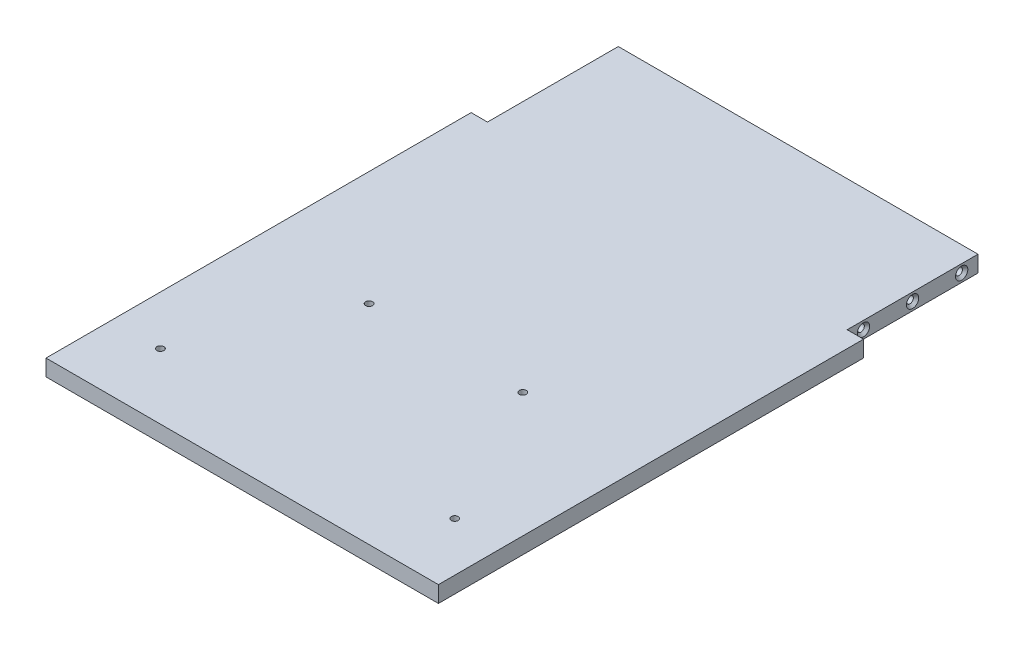
ISO-10303-21;
HEADER;
FILE_DESCRIPTION(('STEP AP214'),'2;1');
FILE_NAME('part.step','',(''),(''),'','','');
FILE_SCHEMA(('AUTOMOTIVE_DESIGN { 1 0 10303 214 1 1 1 1 }'));
ENDSEC;
DATA;
#1=APPLICATION_CONTEXT('core data for automotive mechanical design processes');
#2=APPLICATION_PROTOCOL_DEFINITION('international standard','automotive_design',2000,#1);
#3=PRODUCT_CONTEXT('',#1,'mechanical');
#4=PRODUCT('Part','Part','',(#3));
#5=PRODUCT_RELATED_PRODUCT_CATEGORY('part','',(#4));
#6=PRODUCT_DEFINITION_FORMATION('','',#4);
#7=PRODUCT_DEFINITION_CONTEXT('part definition',#1,'design');
#8=PRODUCT_DEFINITION('design','',#6,#7);
#9=PRODUCT_DEFINITION_SHAPE('','',#8);
#10=(LENGTH_UNIT() NAMED_UNIT(*) SI_UNIT(.MILLI.,.METRE.));
#11=(NAMED_UNIT(*) PLANE_ANGLE_UNIT() SI_UNIT($,.RADIAN.));
#12=(NAMED_UNIT(*) SI_UNIT($,.STERADIAN.) SOLID_ANGLE_UNIT());
#13=UNCERTAINTY_MEASURE_WITH_UNIT(LENGTH_MEASURE(1.E-05),#10,'distance_accuracy_value','');
#14=(GEOMETRIC_REPRESENTATION_CONTEXT(3) GLOBAL_UNCERTAINTY_ASSIGNED_CONTEXT((#13)) GLOBAL_UNIT_ASSIGNED_CONTEXT((#10,
#11,#12)) REPRESENTATION_CONTEXT('',''));
#15=CARTESIAN_POINT('',(0.,0.,0.));
#16=DIRECTION('',(0.,0.,1.));
#17=DIRECTION('',(1.,0.,0.));
#18=AXIS2_PLACEMENT_3D('',#15,#16,#17);
#19=CARTESIAN_POINT('',(0.,6.35,0.));
#20=DIRECTION('',(0.,-1.,0.));
#21=DIRECTION('',(0.,0.,-1.));
#22=AXIS2_PLACEMENT_3D('',#19,#20,#21);
#23=PLANE('',#22);
#24=DIRECTION('',(0.,0.,1.));
#25=VECTOR('',#24,1.);
#26=CARTESIAN_POINT('',(-152.4,6.35,50.8));
#27=LINE('',#26,#25);
#28=CARTESIAN_POINT('',(-152.4,6.35,50.8));
#29=VERTEX_POINT('',#28);
#30=CARTESIAN_POINT('',(-152.4,6.35,215.9));
#31=VERTEX_POINT('',#30);
#32=EDGE_CURVE('E173',#29,#31,#27,.T.);
#33=ORIENTED_EDGE('',*,*,#32,.T.);
#34=DIRECTION('',(1.,0.,0.));
#35=VECTOR('',#34,1.);
#36=CARTESIAN_POINT('',(0.,6.35,215.9));
#37=LINE('',#36,#35);
#38=CARTESIAN_POINT('',(0.,6.35,215.9));
#39=VERTEX_POINT('',#38);
#40=EDGE_CURVE('E107',#31,#39,#37,.T.);
#41=ORIENTED_EDGE('',*,*,#40,.T.);
#42=DIRECTION('',(0.,0.,-1.));
#43=VECTOR('',#42,1.);
#44=CARTESIAN_POINT('',(0.,6.35,50.8));
#45=LINE('',#44,#43);
#46=CARTESIAN_POINT('',(0.,6.35,50.8));
#47=VERTEX_POINT('',#46);
#48=EDGE_CURVE('E194',#39,#47,#45,.T.);
#49=ORIENTED_EDGE('',*,*,#48,.T.);
#50=DIRECTION('',(-1.,0.,0.));
#51=VECTOR('',#50,1.);
#52=CARTESIAN_POINT('',(-6.34999999999999,6.35,50.8));
#53=LINE('',#52,#51);
#54=CARTESIAN_POINT('',(-6.34999999999999,6.35,50.8));
#55=VERTEX_POINT('',#54);
#56=EDGE_CURVE('E207',#47,#55,#53,.T.);
#57=ORIENTED_EDGE('',*,*,#56,.T.);
#58=DIRECTION('',(0.,0.,-1.));
#59=VECTOR('',#58,1.);
#60=CARTESIAN_POINT('',(-6.35,6.35,0.));
#61=LINE('',#60,#59);
#62=CARTESIAN_POINT('',(-6.35,6.35,0.));
#63=VERTEX_POINT('',#62);
#64=EDGE_CURVE('E128',#55,#63,#61,.T.);
#65=ORIENTED_EDGE('',*,*,#64,.T.);
#66=DIRECTION('',(-1.,0.,0.));
#67=VECTOR('',#66,1.);
#68=CARTESIAN_POINT('',(-6.35,6.35,0.));
#69=LINE('',#68,#67);
#70=CARTESIAN_POINT('',(-146.05,6.35,0.));
#71=VERTEX_POINT('',#70);
#72=EDGE_CURVE('E122',#63,#71,#69,.T.);
#73=ORIENTED_EDGE('',*,*,#72,.T.);
#74=DIRECTION('',(0.,0.,1.));
#75=VECTOR('',#74,1.);
#76=CARTESIAN_POINT('',(-146.05,6.35,0.));
#77=LINE('',#76,#75);
#78=CARTESIAN_POINT('',(-146.05,6.35,50.8));
#79=VERTEX_POINT('',#78);
#80=EDGE_CURVE('E126',#71,#79,#77,.T.);
#81=ORIENTED_EDGE('',*,*,#80,.T.);
#82=DIRECTION('',(-1.,0.,0.));
#83=VECTOR('',#82,1.);
#84=CARTESIAN_POINT('',(-146.05,6.35,50.8));
#85=LINE('',#84,#83);
#86=EDGE_CURVE('E63',#79,#29,#85,.T.);
#87=ORIENTED_EDGE('',*,*,#86,.T.);
#88=EDGE_LOOP('',(#33,#41,#49,#57,#65,#73,#81,#87));
#89=FACE_BOUND('',#88,.T.);
#90=CARTESIAN_POINT('',(-19.05,6.35,190.5));
#91=DIRECTION('',(0.,1.,0.));
#92=DIRECTION('',(0.,0.,1.));
#93=AXIS2_PLACEMENT_3D('',#90,#91,#92);
#94=CIRCLE('',#93,1.35254999999999);
#95=CARTESIAN_POINT('',(-19.05,6.35,191.85255));
#96=VERTEX_POINT('',#95);
#97=EDGE_CURVE('E292',#96,#96,#94,.T.);
#98=ORIENTED_EDGE('',*,*,#97,.F.);
#99=EDGE_LOOP('',(#98));
#100=FACE_BOUND('',#99,.T.);
#101=CARTESIAN_POINT('',(-133.35,6.35,190.5));
#102=DIRECTION('',(0.,1.,0.));
#103=DIRECTION('',(0.,0.,1.));
#104=AXIS2_PLACEMENT_3D('',#101,#102,#103);
#105=CIRCLE('',#104,1.35254999999998);
#106=CARTESIAN_POINT('',(-133.35,6.35,191.85255));
#107=VERTEX_POINT('',#106);
#108=EDGE_CURVE('E300',#107,#107,#105,.T.);
#109=ORIENTED_EDGE('',*,*,#108,.F.);
#110=EDGE_LOOP('',(#109));
#111=FACE_BOUND('',#110,.T.);
#112=CARTESIAN_POINT('',(-48.26,6.35,134.874));
#113=DIRECTION('',(0.,1.,0.));
#114=DIRECTION('',(0.,0.,1.));
#115=AXIS2_PLACEMENT_3D('',#112,#113,#114);
#116=CIRCLE('',#115,1.35254999999999);
#117=CARTESIAN_POINT('',(-48.26,6.35,136.22655));
#118=VERTEX_POINT('',#117);
#119=EDGE_CURVE('E308',#118,#118,#116,.T.);
#120=ORIENTED_EDGE('',*,*,#119,.F.);
#121=EDGE_LOOP('',(#120));
#122=FACE_BOUND('',#121,.T.);
#123=CARTESIAN_POINT('',(-107.95,6.35,134.874));
#124=DIRECTION('',(0.,1.,0.));
#125=DIRECTION('',(0.,0.,1.));
#126=AXIS2_PLACEMENT_3D('',#123,#124,#125);
#127=CIRCLE('',#126,1.35254999999998);
#128=CARTESIAN_POINT('',(-107.95,6.35,136.22655));
#129=VERTEX_POINT('',#128);
#130=EDGE_CURVE('E316',#129,#129,#127,.T.);
#131=ORIENTED_EDGE('',*,*,#130,.F.);
#132=EDGE_LOOP('',(#131));
#133=FACE_BOUND('',#132,.T.);
#134=ADVANCED_FACE('F45',(#89,#100,#111,#122,#133),#23,.F.);
#135=CARTESIAN_POINT('',(-152.4,6.35,50.8));
#136=DIRECTION('',(1.,0.,0.));
#137=DIRECTION('',(0.,0.,-1.));
#138=AXIS2_PLACEMENT_3D('',#135,#136,#137);
#139=PLANE('',#138);
#140=DIRECTION('',(0.,0.,1.));
#141=VECTOR('',#140,1.);
#142=CARTESIAN_POINT('',(-152.4,0.,50.8));
#143=LINE('',#142,#141);
#144=CARTESIAN_POINT('',(-152.4,0.,50.8));
#145=VERTEX_POINT('',#144);
#146=CARTESIAN_POINT('',(-152.4,0.,215.9));
#147=VERTEX_POINT('',#146);
#148=EDGE_CURVE('E150',#145,#147,#143,.T.);
#149=ORIENTED_EDGE('',*,*,#148,.T.);
#150=DIRECTION('',(0.,-1.,0.));
#151=VECTOR('',#150,1.);
#152=CARTESIAN_POINT('',(-152.4,6.35,215.9));
#153=LINE('',#152,#151);
#154=EDGE_CURVE('E11',#31,#147,#153,.T.);
#155=ORIENTED_EDGE('',*,*,#154,.F.);
#156=ORIENTED_EDGE('',*,*,#32,.F.);
#157=DIRECTION('',(0.,-1.,0.));
#158=VECTOR('',#157,1.);
#159=CARTESIAN_POINT('',(-152.4,6.35,50.8));
#160=LINE('',#159,#158);
#161=EDGE_CURVE('E146',#29,#145,#160,.T.);
#162=ORIENTED_EDGE('',*,*,#161,.T.);
#163=EDGE_LOOP('',(#149,#155,#156,#162));
#164=FACE_BOUND('',#163,.T.);
#165=ADVANCED_FACE('F47',(#164),#139,.F.);
#166=CARTESIAN_POINT('',(0.,6.35,215.9));
#167=DIRECTION('',(0.,0.,-1.));
#168=DIRECTION('',(-1.,0.,0.));
#169=AXIS2_PLACEMENT_3D('',#166,#167,#168);
#170=PLANE('',#169);
#171=DIRECTION('',(1.,0.,0.));
#172=VECTOR('',#171,1.);
#173=CARTESIAN_POINT('',(0.,0.,215.9));
#174=LINE('',#173,#172);
#175=CARTESIAN_POINT('',(0.,0.,215.9));
#176=VERTEX_POINT('',#175);
#177=EDGE_CURVE('E154',#147,#176,#174,.T.);
#178=ORIENTED_EDGE('',*,*,#177,.T.);
#179=DIRECTION('',(0.,-1.,0.));
#180=VECTOR('',#179,1.);
#181=CARTESIAN_POINT('',(0.,6.35,215.9));
#182=LINE('',#181,#180);
#183=EDGE_CURVE('E55',#39,#176,#182,.T.);
#184=ORIENTED_EDGE('',*,*,#183,.F.);
#185=ORIENTED_EDGE('',*,*,#40,.F.);
#186=ORIENTED_EDGE('',*,*,#154,.T.);
#187=EDGE_LOOP('',(#178,#184,#185,#186));
#188=FACE_BOUND('',#187,.T.);
#189=ADVANCED_FACE('F329',(#188),#170,.F.);
#190=CARTESIAN_POINT('',(0.,6.35,50.8));
#191=DIRECTION('',(-1.,0.,0.));
#192=DIRECTION('',(0.,0.,1.));
#193=AXIS2_PLACEMENT_3D('',#190,#191,#192);
#194=PLANE('',#193);
#195=DIRECTION('',(0.,0.,-1.));
#196=VECTOR('',#195,1.);
#197=CARTESIAN_POINT('',(0.,0.,50.8));
#198=LINE('',#197,#196);
#199=CARTESIAN_POINT('',(0.,0.,50.8));
#200=VERTEX_POINT('',#199);
#201=EDGE_CURVE('E158',#176,#200,#198,.T.);
#202=ORIENTED_EDGE('',*,*,#201,.T.);
#203=DIRECTION('',(0.,-1.,0.));
#204=VECTOR('',#203,1.);
#205=CARTESIAN_POINT('',(0.,6.35,50.8));
#206=LINE('',#205,#204);
#207=EDGE_CURVE('E184',#47,#200,#206,.T.);
#208=ORIENTED_EDGE('',*,*,#207,.F.);
#209=ORIENTED_EDGE('',*,*,#48,.F.);
#210=ORIENTED_EDGE('',*,*,#183,.T.);
#211=EDGE_LOOP('',(#202,#208,#209,#210));
#212=FACE_BOUND('',#211,.T.);
#213=ADVANCED_FACE('F192',(#212),#194,.F.);
#214=CARTESIAN_POINT('',(-6.34999999999999,6.35,50.8));
#215=DIRECTION('',(0.,0.,1.));
#216=DIRECTION('',(1.,0.,0.));
#217=AXIS2_PLACEMENT_3D('',#214,#215,#216);
#218=PLANE('',#217);
#219=DIRECTION('',(-1.,0.,0.));
#220=VECTOR('',#219,1.);
#221=CARTESIAN_POINT('',(-6.34999999999999,0.,50.8));
#222=LINE('',#221,#220);
#223=CARTESIAN_POINT('',(-6.34999999999999,0.,50.8));
#224=VERTEX_POINT('',#223);
#225=EDGE_CURVE('E161',#200,#224,#222,.T.);
#226=ORIENTED_EDGE('',*,*,#225,.T.);
#227=DIRECTION('',(0.,-1.,0.));
#228=VECTOR('',#227,1.);
#229=CARTESIAN_POINT('',(-6.34999999999999,6.35,50.8));
#230=LINE('',#229,#228);
#231=EDGE_CURVE('E180',#55,#224,#230,.T.);
#232=ORIENTED_EDGE('',*,*,#231,.F.);
#233=ORIENTED_EDGE('',*,*,#56,.F.);
#234=ORIENTED_EDGE('',*,*,#207,.T.);
#235=EDGE_LOOP('',(#226,#232,#233,#234));
#236=FACE_BOUND('',#235,.T.);
#237=ADVANCED_FACE('F202',(#236),#218,.F.);
#238=CARTESIAN_POINT('',(-6.35,6.35,0.));
#239=DIRECTION('',(-1.,0.,0.));
#240=DIRECTION('',(0.,0.,1.));
#241=AXIS2_PLACEMENT_3D('',#238,#239,#240);
#242=PLANE('',#241);
#243=CARTESIAN_POINT('',(-6.34999999999999,3.175,44.45));
#244=DIRECTION('',(1.,0.,0.));
#245=DIRECTION('',(0.,0.,-1.));
#246=AXIS2_PLACEMENT_3D('',#243,#244,#245);
#247=CIRCLE('',#246,2.3876);
#248=CARTESIAN_POINT('',(-6.34999999999999,3.175,42.0624));
#249=VERTEX_POINT('',#248);
#250=EDGE_CURVE('E248',#249,#249,#247,.T.);
#251=ORIENTED_EDGE('',*,*,#250,.F.);
#252=EDGE_LOOP('',(#251));
#253=FACE_BOUND('',#252,.T.);
#254=CARTESIAN_POINT('',(-6.35,3.175,25.4));
#255=DIRECTION('',(1.,0.,0.));
#256=DIRECTION('',(0.,0.,-1.));
#257=AXIS2_PLACEMENT_3D('',#254,#255,#256);
#258=CIRCLE('',#257,2.3876);
#259=CARTESIAN_POINT('',(-6.35,3.175,23.0124));
#260=VERTEX_POINT('',#259);
#261=EDGE_CURVE('E236',#260,#260,#258,.T.);
#262=ORIENTED_EDGE('',*,*,#261,.F.);
#263=EDGE_LOOP('',(#262));
#264=FACE_BOUND('',#263,.T.);
#265=CARTESIAN_POINT('',(-6.35,3.175,6.35));
#266=DIRECTION('',(1.,0.,0.));
#267=DIRECTION('',(0.,0.,-1.));
#268=AXIS2_PLACEMENT_3D('',#265,#266,#267);
#269=CIRCLE('',#268,2.3876);
#270=CARTESIAN_POINT('',(-6.35,3.175,3.9624));
#271=VERTEX_POINT('',#270);
#272=EDGE_CURVE('E224',#271,#271,#269,.T.);
#273=ORIENTED_EDGE('',*,*,#272,.F.);
#274=EDGE_LOOP('',(#273));
#275=FACE_BOUND('',#274,.T.);
#276=DIRECTION('',(0.,0.,-1.));
#277=VECTOR('',#276,1.);
#278=CARTESIAN_POINT('',(-6.35,0.,0.));
#279=LINE('',#278,#277);
#280=CARTESIAN_POINT('',(-6.35,0.,0.));
#281=VERTEX_POINT('',#280);
#282=EDGE_CURVE('E164',#224,#281,#279,.T.);
#283=ORIENTED_EDGE('',*,*,#282,.T.);
#284=DIRECTION('',(0.,-1.,0.));
#285=VECTOR('',#284,1.);
#286=CARTESIAN_POINT('',(-6.35,6.35,0.));
#287=LINE('',#286,#285);
#288=EDGE_CURVE('E139',#63,#281,#287,.T.);
#289=ORIENTED_EDGE('',*,*,#288,.F.);
#290=ORIENTED_EDGE('',*,*,#64,.F.);
#291=ORIENTED_EDGE('',*,*,#231,.T.);
#292=EDGE_LOOP('',(#283,#289,#290,#291));
#293=FACE_BOUND('',#292,.T.);
#294=ADVANCED_FACE('F205',(#253,#264,#275,#293),#242,.F.);
#295=CARTESIAN_POINT('',(-6.35,6.35,0.));
#296=DIRECTION('',(0.,0.,1.));
#297=DIRECTION('',(1.,0.,0.));
#298=AXIS2_PLACEMENT_3D('',#295,#296,#297);
#299=PLANE('',#298);
#300=DIRECTION('',(-1.,0.,0.));
#301=VECTOR('',#300,1.);
#302=CARTESIAN_POINT('',(-6.35,0.,0.));
#303=LINE('',#302,#301);
#304=CARTESIAN_POINT('',(-146.05,0.,0.));
#305=VERTEX_POINT('',#304);
#306=EDGE_CURVE('E137',#281,#305,#303,.T.);
#307=ORIENTED_EDGE('',*,*,#306,.T.);
#308=DIRECTION('',(0.,-1.,0.));
#309=VECTOR('',#308,1.);
#310=CARTESIAN_POINT('',(-146.05,6.35,0.));
#311=LINE('',#310,#309);
#312=EDGE_CURVE('E134',#71,#305,#311,.T.);
#313=ORIENTED_EDGE('',*,*,#312,.F.);
#314=ORIENTED_EDGE('',*,*,#72,.F.);
#315=ORIENTED_EDGE('',*,*,#288,.T.);
#316=EDGE_LOOP('',(#307,#313,#314,#315));
#317=FACE_BOUND('',#316,.T.);
#318=ADVANCED_FACE('F135',(#317),#299,.F.);
#319=CARTESIAN_POINT('',(-146.05,6.35,0.));
#320=DIRECTION('',(1.,0.,0.));
#321=DIRECTION('',(0.,0.,-1.));
#322=AXIS2_PLACEMENT_3D('',#319,#320,#321);
#323=PLANE('',#322);
#324=CARTESIAN_POINT('',(-146.05,3.175,6.35));
#325=DIRECTION('',(-1.,0.,0.));
#326=DIRECTION('',(0.,0.,1.));
#327=AXIS2_PLACEMENT_3D('',#324,#325,#326);
#328=CIRCLE('',#327,2.3876);
#329=CARTESIAN_POINT('',(-146.05,3.175,8.7376));
#330=VERTEX_POINT('',#329);
#331=EDGE_CURVE('E284',#330,#330,#328,.T.);
#332=ORIENTED_EDGE('',*,*,#331,.F.);
#333=EDGE_LOOP('',(#332));
#334=FACE_BOUND('',#333,.T.);
#335=CARTESIAN_POINT('',(-146.05,3.175,25.4));
#336=DIRECTION('',(-1.,0.,0.));
#337=DIRECTION('',(0.,0.,1.));
#338=AXIS2_PLACEMENT_3D('',#335,#336,#337);
#339=CIRCLE('',#338,2.3876);
#340=CARTESIAN_POINT('',(-146.05,3.175,27.7876));
#341=VERTEX_POINT('',#340);
#342=EDGE_CURVE('E272',#341,#341,#339,.T.);
#343=ORIENTED_EDGE('',*,*,#342,.F.);
#344=EDGE_LOOP('',(#343));
#345=FACE_BOUND('',#344,.T.);
#346=CARTESIAN_POINT('',(-146.05,3.175,44.45));
#347=DIRECTION('',(-1.,0.,0.));
#348=DIRECTION('',(0.,0.,1.));
#349=AXIS2_PLACEMENT_3D('',#346,#347,#348);
#350=CIRCLE('',#349,2.3876);
#351=CARTESIAN_POINT('',(-146.05,3.175,46.8376));
#352=VERTEX_POINT('',#351);
#353=EDGE_CURVE('E260',#352,#352,#350,.T.);
#354=ORIENTED_EDGE('',*,*,#353,.F.);
#355=EDGE_LOOP('',(#354));
#356=FACE_BOUND('',#355,.T.);
#357=DIRECTION('',(0.,0.,1.));
#358=VECTOR('',#357,1.);
#359=CARTESIAN_POINT('',(-146.05,0.,0.));
#360=LINE('',#359,#358);
#361=CARTESIAN_POINT('',(-146.05,0.,50.8));
#362=VERTEX_POINT('',#361);
#363=EDGE_CURVE('E93',#305,#362,#360,.T.);
#364=ORIENTED_EDGE('',*,*,#363,.T.);
#365=DIRECTION('',(0.,-1.,0.));
#366=VECTOR('',#365,1.);
#367=CARTESIAN_POINT('',(-146.05,6.35,50.8));
#368=LINE('',#367,#366);
#369=EDGE_CURVE('E140',#79,#362,#368,.T.);
#370=ORIENTED_EDGE('',*,*,#369,.F.);
#371=ORIENTED_EDGE('',*,*,#80,.F.);
#372=ORIENTED_EDGE('',*,*,#312,.T.);
#373=EDGE_LOOP('',(#364,#370,#371,#372));
#374=FACE_BOUND('',#373,.T.);
#375=ADVANCED_FACE('F142',(#334,#345,#356,#374),#323,.F.);
#376=CARTESIAN_POINT('',(-146.05,6.35,50.8));
#377=DIRECTION('',(0.,0.,1.));
#378=DIRECTION('',(1.,0.,0.));
#379=AXIS2_PLACEMENT_3D('',#376,#377,#378);
#380=PLANE('',#379);
#381=DIRECTION('',(-1.,0.,0.));
#382=VECTOR('',#381,1.);
#383=CARTESIAN_POINT('',(-146.05,0.,50.8));
#384=LINE('',#383,#382);
#385=EDGE_CURVE('E99',#362,#145,#384,.T.);
#386=ORIENTED_EDGE('',*,*,#385,.T.);
#387=ORIENTED_EDGE('',*,*,#161,.F.);
#388=ORIENTED_EDGE('',*,*,#86,.F.);
#389=ORIENTED_EDGE('',*,*,#369,.T.);
#390=EDGE_LOOP('',(#386,#387,#388,#389));
#391=FACE_BOUND('',#390,.T.);
#392=ADVANCED_FACE('F337',(#391),#380,.F.);
#393=CARTESIAN_POINT('',(0.,0.,0.));
#394=DIRECTION('',(0.,-1.,0.));
#395=DIRECTION('',(0.,0.,-1.));
#396=AXIS2_PLACEMENT_3D('',#393,#394,#395);
#397=PLANE('',#396);
#398=CARTESIAN_POINT('',(-107.95,0.,134.874));
#399=DIRECTION('',(0.,-1.,0.));
#400=DIRECTION('',(0.,0.,-1.));
#401=AXIS2_PLACEMENT_3D('',#398,#399,#400);
#402=CIRCLE('',#401,1.35254999999999);
#403=CARTESIAN_POINT('',(-107.95,0.,133.52145));
#404=VERTEX_POINT('',#403);
#405=EDGE_CURVE('E312',#404,#404,#402,.T.);
#406=ORIENTED_EDGE('',*,*,#405,.F.);
#407=EDGE_LOOP('',(#406));
#408=FACE_BOUND('',#407,.T.);
#409=CARTESIAN_POINT('',(-48.26,0.,134.874));
#410=DIRECTION('',(0.,-1.,0.));
#411=DIRECTION('',(0.,0.,-1.));
#412=AXIS2_PLACEMENT_3D('',#409,#410,#411);
#413=CIRCLE('',#412,1.35254999999999);
#414=CARTESIAN_POINT('',(-48.26,0.,133.52145));
#415=VERTEX_POINT('',#414);
#416=EDGE_CURVE('E304',#415,#415,#413,.T.);
#417=ORIENTED_EDGE('',*,*,#416,.F.);
#418=EDGE_LOOP('',(#417));
#419=FACE_BOUND('',#418,.T.);
#420=CARTESIAN_POINT('',(-133.35,0.,190.5));
#421=DIRECTION('',(0.,-1.,0.));
#422=DIRECTION('',(0.,0.,-1.));
#423=AXIS2_PLACEMENT_3D('',#420,#421,#422);
#424=CIRCLE('',#423,1.35254999999999);
#425=CARTESIAN_POINT('',(-133.35,0.,189.14745));
#426=VERTEX_POINT('',#425);
#427=EDGE_CURVE('E296',#426,#426,#424,.T.);
#428=ORIENTED_EDGE('',*,*,#427,.F.);
#429=EDGE_LOOP('',(#428));
#430=FACE_BOUND('',#429,.T.);
#431=CARTESIAN_POINT('',(-19.05,0.,190.5));
#432=DIRECTION('',(0.,-1.,0.));
#433=DIRECTION('',(0.,0.,-1.));
#434=AXIS2_PLACEMENT_3D('',#431,#432,#433);
#435=CIRCLE('',#434,1.35254999999999);
#436=CARTESIAN_POINT('',(-19.05,0.,189.14745));
#437=VERTEX_POINT('',#436);
#438=EDGE_CURVE('E288',#437,#437,#435,.T.);
#439=ORIENTED_EDGE('',*,*,#438,.F.);
#440=EDGE_LOOP('',(#439));
#441=FACE_BOUND('',#440,.T.);
#442=ORIENTED_EDGE('',*,*,#148,.F.);
#443=ORIENTED_EDGE('',*,*,#385,.F.);
#444=ORIENTED_EDGE('',*,*,#363,.F.);
#445=ORIENTED_EDGE('',*,*,#306,.F.);
#446=ORIENTED_EDGE('',*,*,#282,.F.);
#447=ORIENTED_EDGE('',*,*,#225,.F.);
#448=ORIENTED_EDGE('',*,*,#201,.F.);
#449=ORIENTED_EDGE('',*,*,#177,.F.);
#450=EDGE_LOOP('',(#442,#443,#444,#445,#446,#447,#448,#449));
#451=FACE_BOUND('',#450,.T.);
#452=ADVANCED_FACE('F198',(#408,#419,#430,#441,#451),#397,.T.);
#453=CARTESIAN_POINT('',(-18.2373059697343,3.175,6.35));
#454=DIRECTION('',(1.,0.,0.));
#455=DIRECTION('',(0.,0.,-1.));
#456=AXIS2_PLACEMENT_3D('',#453,#454,#455);
#457=CONICAL_SURFACE('',#456,1.35255,1.02974425867665);
#458=CARTESIAN_POINT('',(-19.05,3.175,6.35));
#459=VERTEX_POINT('',#458);
#460=VERTEX_LOOP('',#459);
#461=FACE_BOUND('',#460,.T.);
#462=CARTESIAN_POINT('',(-18.2373059697343,3.175,6.35));
#463=DIRECTION('',(1.,0.,0.));
#464=DIRECTION('',(0.,0.,-1.));
#465=AXIS2_PLACEMENT_3D('',#462,#463,#464);
#466=CIRCLE('',#465,1.35255);
#467=CARTESIAN_POINT('',(-18.2373059697343,3.175,4.99745000000001));
#468=VERTEX_POINT('',#467);
#469=EDGE_CURVE('E155',#468,#468,#466,.T.);
#470=ORIENTED_EDGE('',*,*,#469,.T.);
#471=EDGE_LOOP('',(#470));
#472=FACE_BOUND('',#471,.T.);
#473=ADVANCED_FACE('F333',(#461,#472),#457,.F.);
#474=CARTESIAN_POINT('',(-6.35,3.175,6.35));
#475=DIRECTION('',(1.,0.,0.));
#476=DIRECTION('',(0.,0.,-1.));
#477=AXIS2_PLACEMENT_3D('',#474,#475,#476);
#478=CYLINDRICAL_SURFACE('',#477,1.35255);
#479=ORIENTED_EDGE('',*,*,#469,.F.);
#480=EDGE_LOOP('',(#479));
#481=FACE_BOUND('',#480,.T.);
#482=CARTESIAN_POINT('',(-7.38505,3.175,6.35));
#483=DIRECTION('',(1.,0.,0.));
#484=DIRECTION('',(0.,0.,-1.));
#485=AXIS2_PLACEMENT_3D('',#482,#483,#484);
#486=CIRCLE('',#485,1.35255);
#487=CARTESIAN_POINT('',(-7.38505,3.175,4.99745));
#488=VERTEX_POINT('',#487);
#489=EDGE_CURVE('E220',#488,#488,#486,.T.);
#490=ORIENTED_EDGE('',*,*,#489,.T.);
#491=EDGE_LOOP('',(#490));
#492=FACE_BOUND('',#491,.T.);
#493=ADVANCED_FACE('F400',(#481,#492),#478,.F.);
#494=CARTESIAN_POINT('',(-6.35,3.175,6.35));
#495=DIRECTION('',(1.,0.,0.));
#496=DIRECTION('',(0.,0.,-1.));
#497=AXIS2_PLACEMENT_3D('',#494,#495,#496);
#498=CONICAL_SURFACE('',#497,2.3876,0.785398163397448);
#499=ORIENTED_EDGE('',*,*,#489,.F.);
#500=EDGE_LOOP('',(#499));
#501=FACE_BOUND('',#500,.T.);
#502=ORIENTED_EDGE('',*,*,#272,.T.);
#503=EDGE_LOOP('',(#502));
#504=FACE_BOUND('',#503,.T.);
#505=ADVANCED_FACE('F407',(#501,#504),#498,.F.);
#506=CARTESIAN_POINT('',(-18.2373059697343,3.175,25.4));
#507=DIRECTION('',(1.,0.,0.));
#508=DIRECTION('',(0.,0.,-1.));
#509=AXIS2_PLACEMENT_3D('',#506,#507,#508);
#510=CONICAL_SURFACE('',#509,1.35255,1.02974425867665);
#511=CARTESIAN_POINT('',(-19.05,3.175,25.4));
#512=VERTEX_POINT('',#511);
#513=VERTEX_LOOP('',#512);
#514=FACE_BOUND('',#513,.T.);
#515=CARTESIAN_POINT('',(-18.2373059697343,3.175,25.4));
#516=DIRECTION('',(1.,0.,0.));
#517=DIRECTION('',(0.,0.,-1.));
#518=AXIS2_PLACEMENT_3D('',#515,#516,#517);
#519=CIRCLE('',#518,1.35255);
#520=CARTESIAN_POINT('',(-18.2373059697343,3.175,24.04745));
#521=VERTEX_POINT('',#520);
#522=EDGE_CURVE('E228',#521,#521,#519,.T.);
#523=ORIENTED_EDGE('',*,*,#522,.T.);
#524=EDGE_LOOP('',(#523));
#525=FACE_BOUND('',#524,.T.);
#526=ADVANCED_FACE('F415',(#514,#525),#510,.F.);
#527=CARTESIAN_POINT('',(-6.35,3.175,25.4));
#528=DIRECTION('',(1.,0.,0.));
#529=DIRECTION('',(0.,0.,-1.));
#530=AXIS2_PLACEMENT_3D('',#527,#528,#529);
#531=CYLINDRICAL_SURFACE('',#530,1.35255);
#532=ORIENTED_EDGE('',*,*,#522,.F.);
#533=EDGE_LOOP('',(#532));
#534=FACE_BOUND('',#533,.T.);
#535=CARTESIAN_POINT('',(-7.38505,3.175,25.4));
#536=DIRECTION('',(1.,0.,0.));
#537=DIRECTION('',(0.,0.,-1.));
#538=AXIS2_PLACEMENT_3D('',#535,#536,#537);
#539=CIRCLE('',#538,1.35255);
#540=CARTESIAN_POINT('',(-7.38505,3.175,24.04745));
#541=VERTEX_POINT('',#540);
#542=EDGE_CURVE('E232',#541,#541,#539,.T.);
#543=ORIENTED_EDGE('',*,*,#542,.T.);
#544=EDGE_LOOP('',(#543));
#545=FACE_BOUND('',#544,.T.);
#546=ADVANCED_FACE('F424',(#534,#545),#531,.F.);
#547=CARTESIAN_POINT('',(-6.35,3.175,25.4));
#548=DIRECTION('',(1.,0.,0.));
#549=DIRECTION('',(0.,0.,-1.));
#550=AXIS2_PLACEMENT_3D('',#547,#548,#549);
#551=CONICAL_SURFACE('',#550,2.3876,0.785398163397448);
#552=ORIENTED_EDGE('',*,*,#542,.F.);
#553=EDGE_LOOP('',(#552));
#554=FACE_BOUND('',#553,.T.);
#555=ORIENTED_EDGE('',*,*,#261,.T.);
#556=EDGE_LOOP('',(#555));
#557=FACE_BOUND('',#556,.T.);
#558=ADVANCED_FACE('F432',(#554,#557),#551,.F.);
#559=CARTESIAN_POINT('',(-18.2373059697343,3.175,44.45));
#560=DIRECTION('',(1.,0.,0.));
#561=DIRECTION('',(0.,0.,-1.));
#562=AXIS2_PLACEMENT_3D('',#559,#560,#561);
#563=CONICAL_SURFACE('',#562,1.35255,1.02974425867665);
#564=CARTESIAN_POINT('',(-19.05,3.175,44.45));
#565=VERTEX_POINT('',#564);
#566=VERTEX_LOOP('',#565);
#567=FACE_BOUND('',#566,.T.);
#568=CARTESIAN_POINT('',(-18.2373059697343,3.175,44.45));
#569=DIRECTION('',(1.,0.,0.));
#570=DIRECTION('',(0.,0.,-1.));
#571=AXIS2_PLACEMENT_3D('',#568,#569,#570);
#572=CIRCLE('',#571,1.35255);
#573=CARTESIAN_POINT('',(-18.2373059697343,3.175,43.09745));
#574=VERTEX_POINT('',#573);
#575=EDGE_CURVE('E240',#574,#574,#572,.T.);
#576=ORIENTED_EDGE('',*,*,#575,.T.);
#577=EDGE_LOOP('',(#576));
#578=FACE_BOUND('',#577,.T.);
#579=ADVANCED_FACE('F441',(#567,#578),#563,.F.);
#580=CARTESIAN_POINT('',(-6.34999999999999,3.175,44.45));
#581=DIRECTION('',(1.,0.,0.));
#582=DIRECTION('',(0.,0.,-1.));
#583=AXIS2_PLACEMENT_3D('',#580,#581,#582);
#584=CYLINDRICAL_SURFACE('',#583,1.35255);
#585=ORIENTED_EDGE('',*,*,#575,.F.);
#586=EDGE_LOOP('',(#585));
#587=FACE_BOUND('',#586,.T.);
#588=CARTESIAN_POINT('',(-7.38505,3.175,44.45));
#589=DIRECTION('',(1.,0.,0.));
#590=DIRECTION('',(0.,0.,-1.));
#591=AXIS2_PLACEMENT_3D('',#588,#589,#590);
#592=CIRCLE('',#591,1.35255);
#593=CARTESIAN_POINT('',(-7.38505,3.175,43.09745));
#594=VERTEX_POINT('',#593);
#595=EDGE_CURVE('E244',#594,#594,#592,.T.);
#596=ORIENTED_EDGE('',*,*,#595,.T.);
#597=EDGE_LOOP('',(#596));
#598=FACE_BOUND('',#597,.T.);
#599=ADVANCED_FACE('F449',(#587,#598),#584,.F.);
#600=CARTESIAN_POINT('',(-6.34999999999999,3.175,44.45));
#601=DIRECTION('',(1.,0.,0.));
#602=DIRECTION('',(0.,0.,-1.));
#603=AXIS2_PLACEMENT_3D('',#600,#601,#602);
#604=CONICAL_SURFACE('',#603,2.3876,0.785398163397448);
#605=ORIENTED_EDGE('',*,*,#595,.F.);
#606=EDGE_LOOP('',(#605));
#607=FACE_BOUND('',#606,.T.);
#608=ORIENTED_EDGE('',*,*,#250,.T.);
#609=EDGE_LOOP('',(#608));
#610=FACE_BOUND('',#609,.T.);
#611=ADVANCED_FACE('F457',(#607,#610),#604,.F.);
#612=CARTESIAN_POINT('',(-134.162694030266,3.175,44.45));
#613=DIRECTION('',(-1.,0.,0.));
#614=DIRECTION('',(0.,0.,1.));
#615=AXIS2_PLACEMENT_3D('',#612,#613,#614);
#616=CONICAL_SURFACE('',#615,1.35255,1.02974425867666);
#617=CARTESIAN_POINT('',(-133.35,3.175,44.45));
#618=VERTEX_POINT('',#617);
#619=VERTEX_LOOP('',#618);
#620=FACE_BOUND('',#619,.T.);
#621=CARTESIAN_POINT('',(-134.162694030266,3.175,44.45));
#622=DIRECTION('',(-1.,0.,0.));
#623=DIRECTION('',(0.,0.,1.));
#624=AXIS2_PLACEMENT_3D('',#621,#622,#623);
#625=CIRCLE('',#624,1.35255);
#626=CARTESIAN_POINT('',(-134.162694030266,3.175,45.80255));
#627=VERTEX_POINT('',#626);
#628=EDGE_CURVE('E252',#627,#627,#625,.T.);
#629=ORIENTED_EDGE('',*,*,#628,.T.);
#630=EDGE_LOOP('',(#629));
#631=FACE_BOUND('',#630,.T.);
#632=ADVANCED_FACE('F465',(#620,#631),#616,.F.);
#633=CARTESIAN_POINT('',(-146.05,3.175,44.45));
#634=DIRECTION('',(-1.,0.,0.));
#635=DIRECTION('',(0.,0.,1.));
#636=AXIS2_PLACEMENT_3D('',#633,#634,#635);
#637=CYLINDRICAL_SURFACE('',#636,1.35254999999999);
#638=ORIENTED_EDGE('',*,*,#628,.F.);
#639=EDGE_LOOP('',(#638));
#640=FACE_BOUND('',#639,.T.);
#641=CARTESIAN_POINT('',(-145.01495,3.175,44.45));
#642=DIRECTION('',(-1.,0.,0.));
#643=DIRECTION('',(0.,0.,1.));
#644=AXIS2_PLACEMENT_3D('',#641,#642,#643);
#645=CIRCLE('',#644,1.35254999999999);
#646=CARTESIAN_POINT('',(-145.01495,3.175,45.80255));
#647=VERTEX_POINT('',#646);
#648=EDGE_CURVE('E256',#647,#647,#645,.T.);
#649=ORIENTED_EDGE('',*,*,#648,.T.);
#650=EDGE_LOOP('',(#649));
#651=FACE_BOUND('',#650,.T.);
#652=ADVANCED_FACE('F473',(#640,#651),#637,.F.);
#653=CARTESIAN_POINT('',(-146.05,3.175,44.45));
#654=DIRECTION('',(-1.,0.,0.));
#655=DIRECTION('',(0.,0.,1.));
#656=AXIS2_PLACEMENT_3D('',#653,#654,#655);
#657=CONICAL_SURFACE('',#656,2.3876,0.785398163397449);
#658=ORIENTED_EDGE('',*,*,#648,.F.);
#659=EDGE_LOOP('',(#658));
#660=FACE_BOUND('',#659,.T.);
#661=ORIENTED_EDGE('',*,*,#353,.T.);
#662=EDGE_LOOP('',(#661));
#663=FACE_BOUND('',#662,.T.);
#664=ADVANCED_FACE('F482',(#660,#663),#657,.F.);
#665=CARTESIAN_POINT('',(-134.162694030266,3.175,25.4));
#666=DIRECTION('',(-1.,0.,0.));
#667=DIRECTION('',(0.,0.,1.));
#668=AXIS2_PLACEMENT_3D('',#665,#666,#667);
#669=CONICAL_SURFACE('',#668,1.35255,1.02974425867666);
#670=CARTESIAN_POINT('',(-133.35,3.175,25.4));
#671=VERTEX_POINT('',#670);
#672=VERTEX_LOOP('',#671);
#673=FACE_BOUND('',#672,.T.);
#674=CARTESIAN_POINT('',(-134.162694030266,3.175,25.4));
#675=DIRECTION('',(-1.,0.,0.));
#676=DIRECTION('',(0.,0.,1.));
#677=AXIS2_PLACEMENT_3D('',#674,#675,#676);
#678=CIRCLE('',#677,1.35255);
#679=CARTESIAN_POINT('',(-134.162694030266,3.175,26.75255));
#680=VERTEX_POINT('',#679);
#681=EDGE_CURVE('E264',#680,#680,#678,.T.);
#682=ORIENTED_EDGE('',*,*,#681,.T.);
#683=EDGE_LOOP('',(#682));
#684=FACE_BOUND('',#683,.T.);
#685=ADVANCED_FACE('F490',(#673,#684),#669,.F.);
#686=CARTESIAN_POINT('',(-146.05,3.175,25.4));
#687=DIRECTION('',(-1.,0.,0.));
#688=DIRECTION('',(0.,0.,1.));
#689=AXIS2_PLACEMENT_3D('',#686,#687,#688);
#690=CYLINDRICAL_SURFACE('',#689,1.35254999999999);
#691=ORIENTED_EDGE('',*,*,#681,.F.);
#692=EDGE_LOOP('',(#691));
#693=FACE_BOUND('',#692,.T.);
#694=CARTESIAN_POINT('',(-145.01495,3.175,25.4));
#695=DIRECTION('',(-1.,0.,0.));
#696=DIRECTION('',(0.,0.,1.));
#697=AXIS2_PLACEMENT_3D('',#694,#695,#696);
#698=CIRCLE('',#697,1.35254999999999);
#699=CARTESIAN_POINT('',(-145.01495,3.175,26.75255));
#700=VERTEX_POINT('',#699);
#701=EDGE_CURVE('E268',#700,#700,#698,.T.);
#702=ORIENTED_EDGE('',*,*,#701,.T.);
#703=EDGE_LOOP('',(#702));
#704=FACE_BOUND('',#703,.T.);
#705=ADVANCED_FACE('F499',(#693,#704),#690,.F.);
#706=CARTESIAN_POINT('',(-146.05,3.175,25.4));
#707=DIRECTION('',(-1.,0.,0.));
#708=DIRECTION('',(0.,0.,1.));
#709=AXIS2_PLACEMENT_3D('',#706,#707,#708);
#710=CONICAL_SURFACE('',#709,2.3876,0.785398163397449);
#711=ORIENTED_EDGE('',*,*,#701,.F.);
#712=EDGE_LOOP('',(#711));
#713=FACE_BOUND('',#712,.T.);
#714=ORIENTED_EDGE('',*,*,#342,.T.);
#715=EDGE_LOOP('',(#714));
#716=FACE_BOUND('',#715,.T.);
#717=ADVANCED_FACE('F507',(#713,#716),#710,.F.);
#718=CARTESIAN_POINT('',(-134.162694030266,3.175,6.35));
#719=DIRECTION('',(-1.,0.,0.));
#720=DIRECTION('',(0.,0.,1.));
#721=AXIS2_PLACEMENT_3D('',#718,#719,#720);
#722=CONICAL_SURFACE('',#721,1.35255,1.02974425867666);
#723=CARTESIAN_POINT('',(-133.35,3.175,6.35));
#724=VERTEX_POINT('',#723);
#725=VERTEX_LOOP('',#724);
#726=FACE_BOUND('',#725,.T.);
#727=CARTESIAN_POINT('',(-134.162694030266,3.175,6.35));
#728=DIRECTION('',(-1.,0.,0.));
#729=DIRECTION('',(0.,0.,1.));
#730=AXIS2_PLACEMENT_3D('',#727,#728,#729);
#731=CIRCLE('',#730,1.35255);
#732=CARTESIAN_POINT('',(-134.162694030266,3.175,7.70255));
#733=VERTEX_POINT('',#732);
#734=EDGE_CURVE('E276',#733,#733,#731,.T.);
#735=ORIENTED_EDGE('',*,*,#734,.T.);
#736=EDGE_LOOP('',(#735));
#737=FACE_BOUND('',#736,.T.);
#738=ADVANCED_FACE('F516',(#726,#737),#722,.F.);
#739=CARTESIAN_POINT('',(-146.05,3.175,6.35));
#740=DIRECTION('',(-1.,0.,0.));
#741=DIRECTION('',(0.,0.,1.));
#742=AXIS2_PLACEMENT_3D('',#739,#740,#741);
#743=CYLINDRICAL_SURFACE('',#742,1.35254999999999);
#744=ORIENTED_EDGE('',*,*,#734,.F.);
#745=EDGE_LOOP('',(#744));
#746=FACE_BOUND('',#745,.T.);
#747=CARTESIAN_POINT('',(-145.01495,3.175,6.35));
#748=DIRECTION('',(-1.,0.,0.));
#749=DIRECTION('',(0.,0.,1.));
#750=AXIS2_PLACEMENT_3D('',#747,#748,#749);
#751=CIRCLE('',#750,1.35254999999999);
#752=CARTESIAN_POINT('',(-145.01495,3.175,7.70254999999999));
#753=VERTEX_POINT('',#752);
#754=EDGE_CURVE('E280',#753,#753,#751,.T.);
#755=ORIENTED_EDGE('',*,*,#754,.T.);
#756=EDGE_LOOP('',(#755));
#757=FACE_BOUND('',#756,.T.);
#758=ADVANCED_FACE('F524',(#746,#757),#743,.F.);
#759=CARTESIAN_POINT('',(-146.05,3.175,6.35));
#760=DIRECTION('',(-1.,0.,0.));
#761=DIRECTION('',(0.,0.,1.));
#762=AXIS2_PLACEMENT_3D('',#759,#760,#761);
#763=CONICAL_SURFACE('',#762,2.3876,0.785398163397449);
#764=ORIENTED_EDGE('',*,*,#754,.F.);
#765=EDGE_LOOP('',(#764));
#766=FACE_BOUND('',#765,.T.);
#767=ORIENTED_EDGE('',*,*,#331,.T.);
#768=EDGE_LOOP('',(#767));
#769=FACE_BOUND('',#768,.T.);
#770=ADVANCED_FACE('F532',(#766,#769),#763,.F.);
#771=CARTESIAN_POINT('',(-19.05,6.35,190.5));
#772=DIRECTION('',(0.,1.,0.));
#773=DIRECTION('',(0.,0.,1.));
#774=AXIS2_PLACEMENT_3D('',#771,#772,#773);
#775=CYLINDRICAL_SURFACE('',#774,1.35254999999999);
#776=ORIENTED_EDGE('',*,*,#97,.T.);
#777=EDGE_LOOP('',(#776));
#778=FACE_BOUND('',#777,.T.);
#779=ORIENTED_EDGE('',*,*,#438,.T.);
#780=EDGE_LOOP('',(#779));
#781=FACE_BOUND('',#780,.T.);
#782=ADVANCED_FACE('F540',(#778,#781),#775,.F.);
#783=CARTESIAN_POINT('',(-133.35,6.35,190.5));
#784=DIRECTION('',(0.,1.,0.));
#785=DIRECTION('',(0.,0.,1.));
#786=AXIS2_PLACEMENT_3D('',#783,#784,#785);
#787=CYLINDRICAL_SURFACE('',#786,1.35254999999999);
#788=ORIENTED_EDGE('',*,*,#108,.T.);
#789=EDGE_LOOP('',(#788));
#790=FACE_BOUND('',#789,.T.);
#791=ORIENTED_EDGE('',*,*,#427,.T.);
#792=EDGE_LOOP('',(#791));
#793=FACE_BOUND('',#792,.T.);
#794=ADVANCED_FACE('F548',(#790,#793),#787,.F.);
#795=CARTESIAN_POINT('',(-48.26,6.35,134.874));
#796=DIRECTION('',(0.,1.,0.));
#797=DIRECTION('',(0.,0.,1.));
#798=AXIS2_PLACEMENT_3D('',#795,#796,#797);
#799=CYLINDRICAL_SURFACE('',#798,1.35254999999999);
#800=ORIENTED_EDGE('',*,*,#119,.T.);
#801=EDGE_LOOP('',(#800));
#802=FACE_BOUND('',#801,.T.);
#803=ORIENTED_EDGE('',*,*,#416,.T.);
#804=EDGE_LOOP('',(#803));
#805=FACE_BOUND('',#804,.T.);
#806=ADVANCED_FACE('F556',(#802,#805),#799,.F.);
#807=CARTESIAN_POINT('',(-107.95,6.35,134.874));
#808=DIRECTION('',(0.,1.,0.));
#809=DIRECTION('',(0.,0.,1.));
#810=AXIS2_PLACEMENT_3D('',#807,#808,#809);
#811=CYLINDRICAL_SURFACE('',#810,1.35254999999999);
#812=ORIENTED_EDGE('',*,*,#130,.T.);
#813=EDGE_LOOP('',(#812));
#814=FACE_BOUND('',#813,.T.);
#815=ORIENTED_EDGE('',*,*,#405,.T.);
#816=EDGE_LOOP('',(#815));
#817=FACE_BOUND('',#816,.T.);
#818=ADVANCED_FACE('F321',(#814,#817),#811,.F.);
#819=CLOSED_SHELL('',(#134,#165,#189,#213,#237,#294,#318,#375,#392,#452,#473,#493,#505,#526,
#546,#558,#579,#599,#611,#632,#652,#664,#685,#705,#717,#738,#758,#770,#782,#794,#806,#818));
#820=MANIFOLD_SOLID_BREP('B2',#819);
#821=ADVANCED_BREP_SHAPE_REPRESENTATION('',(#18,#820),#14);
#822=SHAPE_DEFINITION_REPRESENTATION(#9,#821);
ENDSEC;
END-ISO-10303-21;
